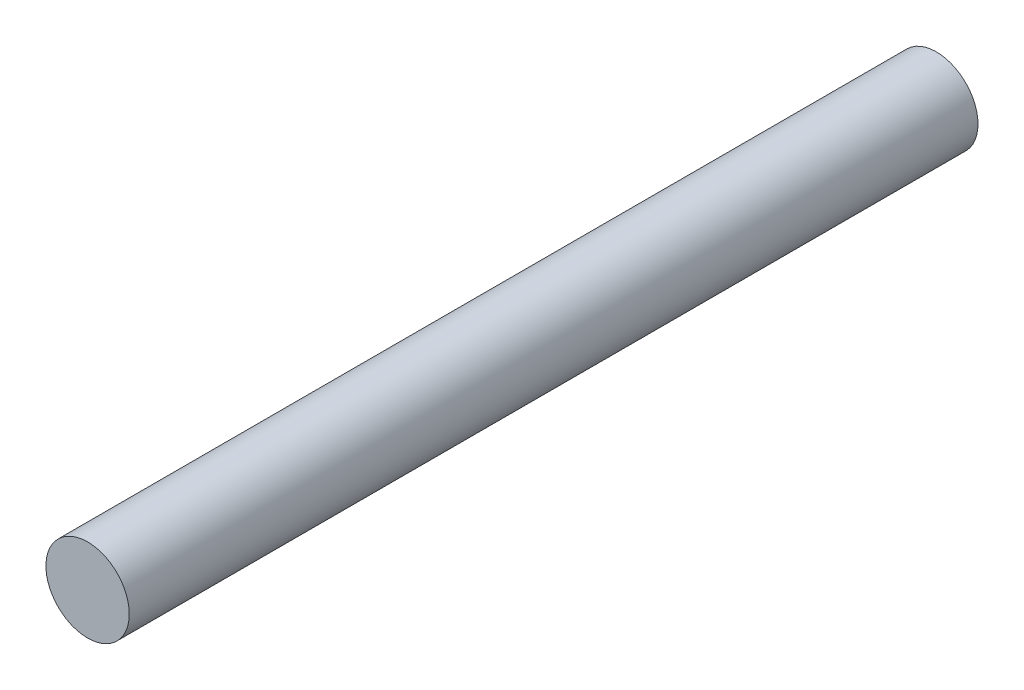
ISO-10303-21;
HEADER;
FILE_DESCRIPTION(('STEP AP214'),'2;1');
FILE_NAME('part.step','',(''),(''),'','','');
FILE_SCHEMA(('AUTOMOTIVE_DESIGN { 1 0 10303 214 1 1 1 1 }'));
ENDSEC;
DATA;
#1=APPLICATION_CONTEXT('core data for automotive mechanical design processes');
#2=APPLICATION_PROTOCOL_DEFINITION('international standard','automotive_design',2000,#1);
#3=PRODUCT_CONTEXT('',#1,'mechanical');
#4=PRODUCT('Part','Part','',(#3));
#5=PRODUCT_RELATED_PRODUCT_CATEGORY('part','',(#4));
#6=PRODUCT_DEFINITION_FORMATION('','',#4);
#7=PRODUCT_DEFINITION_CONTEXT('part definition',#1,'design');
#8=PRODUCT_DEFINITION('design','',#6,#7);
#9=PRODUCT_DEFINITION_SHAPE('','',#8);
#10=(LENGTH_UNIT() NAMED_UNIT(*) SI_UNIT(.MILLI.,.METRE.));
#11=(NAMED_UNIT(*) PLANE_ANGLE_UNIT() SI_UNIT($,.RADIAN.));
#12=(NAMED_UNIT(*) SI_UNIT($,.STERADIAN.) SOLID_ANGLE_UNIT());
#13=UNCERTAINTY_MEASURE_WITH_UNIT(LENGTH_MEASURE(1.E-05),#10,'distance_accuracy_value','');
#14=(GEOMETRIC_REPRESENTATION_CONTEXT(3) GLOBAL_UNCERTAINTY_ASSIGNED_CONTEXT((#13)) GLOBAL_UNIT_ASSIGNED_CONTEXT((#10,
#11,#12)) REPRESENTATION_CONTEXT('',''));
#15=CARTESIAN_POINT('',(0.,0.,0.));
#16=DIRECTION('',(0.,0.,1.));
#17=DIRECTION('',(1.,0.,0.));
#18=AXIS2_PLACEMENT_3D('',#15,#16,#17);
#19=CARTESIAN_POINT('',(0.,0.,101.85));
#20=DIRECTION('',(0.,0.,-1.));
#21=DIRECTION('',(-1.,0.,0.));
#22=AXIS2_PLACEMENT_3D('',#19,#20,#21);
#23=CYLINDRICAL_SURFACE('',#22,5.);
#24=CARTESIAN_POINT('',(0.,0.,101.85));
#25=DIRECTION('',(0.,0.,1.));
#26=DIRECTION('',(1.,0.,0.));
#27=AXIS2_PLACEMENT_3D('',#24,#25,#26);
#28=CIRCLE('',#27,5.);
#29=CARTESIAN_POINT('',(5.,0.,101.85));
#30=VERTEX_POINT('',#29);
#31=EDGE_CURVE('E10',#30,#30,#28,.T.);
#32=ORIENTED_EDGE('',*,*,#31,.F.);
#33=EDGE_LOOP('',(#32));
#34=FACE_BOUND('',#33,.T.);
#35=CARTESIAN_POINT('',(0.,0.,0.));
#36=DIRECTION('',(0.,0.,1.));
#37=DIRECTION('',(1.,0.,0.));
#38=AXIS2_PLACEMENT_3D('',#35,#36,#37);
#39=CIRCLE('',#38,5.);
#40=CARTESIAN_POINT('',(5.,0.,0.));
#41=VERTEX_POINT('',#40);
#42=EDGE_CURVE('E46',#41,#41,#39,.T.);
#43=ORIENTED_EDGE('',*,*,#42,.T.);
#44=EDGE_LOOP('',(#43));
#45=FACE_BOUND('',#44,.T.);
#46=ADVANCED_FACE('F43',(#34,#45),#23,.T.);
#47=CARTESIAN_POINT('',(0.,0.,101.85));
#48=DIRECTION('',(0.,0.,1.));
#49=DIRECTION('',(1.,0.,0.));
#50=AXIS2_PLACEMENT_3D('',#47,#48,#49);
#51=PLANE('',#50);
#52=ORIENTED_EDGE('',*,*,#31,.T.);
#53=EDGE_LOOP('',(#52));
#54=FACE_BOUND('',#53,.T.);
#55=ADVANCED_FACE('F60',(#54),#51,.T.);
#56=CARTESIAN_POINT('',(0.,0.,0.));
#57=DIRECTION('',(0.,0.,1.));
#58=DIRECTION('',(1.,0.,0.));
#59=AXIS2_PLACEMENT_3D('',#56,#57,#58);
#60=PLANE('',#59);
#61=ORIENTED_EDGE('',*,*,#42,.F.);
#62=EDGE_LOOP('',(#61));
#63=FACE_BOUND('',#62,.T.);
#64=ADVANCED_FACE('F58',(#63),#60,.F.);
#65=CLOSED_SHELL('',(#46,#55,#64));
#66=MANIFOLD_SOLID_BREP('B2',#65);
#67=ADVANCED_BREP_SHAPE_REPRESENTATION('',(#18,#66),#14);
#68=SHAPE_DEFINITION_REPRESENTATION(#9,#67);
ENDSEC;
END-ISO-10303-21;
